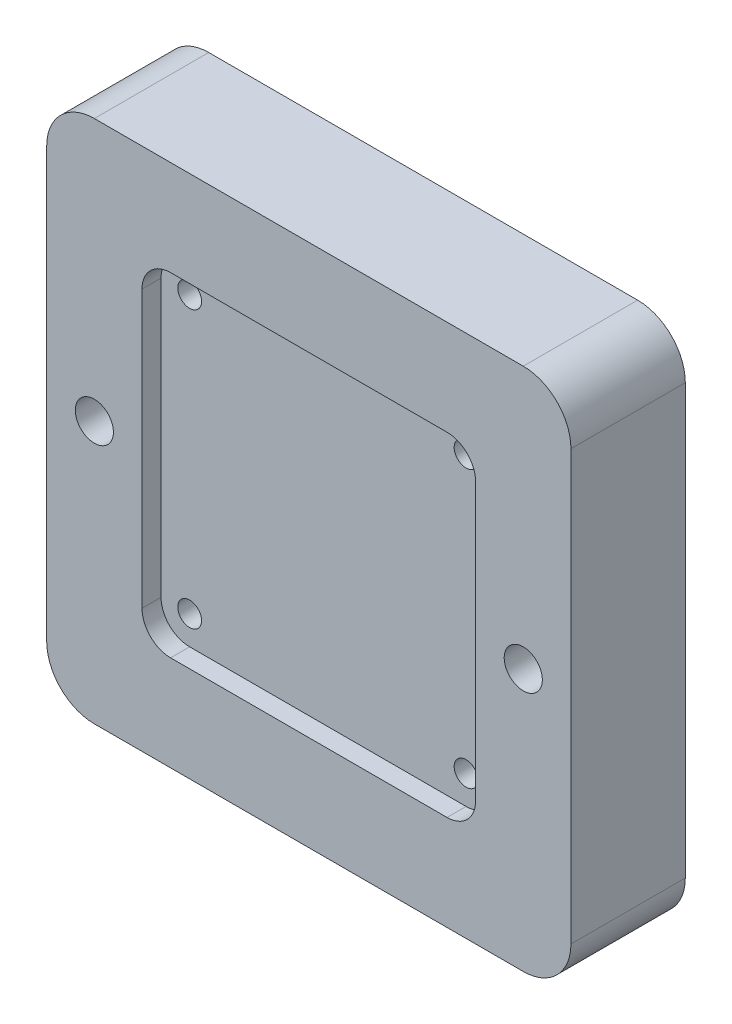
ISO-10303-21;
HEADER;
FILE_DESCRIPTION(('STEP AP214'),'2;1');
FILE_NAME('part.step','',(''),(''),'','','');
FILE_SCHEMA(('AUTOMOTIVE_DESIGN { 1 0 10303 214 1 1 1 1 }'));
ENDSEC;
DATA;
#1=APPLICATION_CONTEXT('core data for automotive mechanical design processes');
#2=APPLICATION_PROTOCOL_DEFINITION('international standard','automotive_design',2000,#1);
#3=PRODUCT_CONTEXT('',#1,'mechanical');
#4=PRODUCT('Part','Part','',(#3));
#5=PRODUCT_RELATED_PRODUCT_CATEGORY('part','',(#4));
#6=PRODUCT_DEFINITION_FORMATION('','',#4);
#7=PRODUCT_DEFINITION_CONTEXT('part definition',#1,'design');
#8=PRODUCT_DEFINITION('design','',#6,#7);
#9=PRODUCT_DEFINITION_SHAPE('','',#8);
#10=(LENGTH_UNIT() NAMED_UNIT(*) SI_UNIT(.MILLI.,.METRE.));
#11=(NAMED_UNIT(*) PLANE_ANGLE_UNIT() SI_UNIT($,.RADIAN.));
#12=(NAMED_UNIT(*) SI_UNIT($,.STERADIAN.) SOLID_ANGLE_UNIT());
#13=UNCERTAINTY_MEASURE_WITH_UNIT(LENGTH_MEASURE(1.E-05),#10,'distance_accuracy_value','');
#14=(GEOMETRIC_REPRESENTATION_CONTEXT(3) GLOBAL_UNCERTAINTY_ASSIGNED_CONTEXT((#13)) GLOBAL_UNIT_ASSIGNED_CONTEXT((#10,
#11,#12)) REPRESENTATION_CONTEXT('',''));
#15=CARTESIAN_POINT('',(0.,0.,0.));
#16=DIRECTION('',(0.,0.,1.));
#17=DIRECTION('',(1.,0.,0.));
#18=AXIS2_PLACEMENT_3D('',#15,#16,#17);
#19=CARTESIAN_POINT('',(45.,45.,-4.));
#20=DIRECTION('',(0.,0.,1.));
#21=DIRECTION('',(1.,0.,0.));
#22=AXIS2_PLACEMENT_3D('',#19,#20,#21);
#23=CYLINDRICAL_SURFACE('',#22,9.99999999999999);
#24=CARTESIAN_POINT('',(45.,45.,0.));
#25=DIRECTION('',(0.,0.,1.));
#26=DIRECTION('',(-1.,0.,0.));
#27=AXIS2_PLACEMENT_3D('',#24,#25,#26);
#28=CIRCLE('',#27,9.99999999999999);
#29=CARTESIAN_POINT('',(55.,45.,0.));
#30=VERTEX_POINT('',#29);
#31=CARTESIAN_POINT('',(45.,55.,0.));
#32=VERTEX_POINT('',#31);
#33=EDGE_CURVE('E284',#30,#32,#28,.T.);
#34=ORIENTED_EDGE('',*,*,#33,.F.);
#35=DIRECTION('',(0.,0.,1.));
#36=VECTOR('',#35,1.);
#37=CARTESIAN_POINT('',(55.,45.,-4.));
#38=LINE('',#37,#36);
#39=CARTESIAN_POINT('',(55.,45.,-24.));
#40=VERTEX_POINT('',#39);
#41=EDGE_CURVE('E11',#40,#30,#38,.T.);
#42=ORIENTED_EDGE('',*,*,#41,.F.);
#43=CARTESIAN_POINT('',(45.,45.,-24.));
#44=DIRECTION('',(0.,0.,1.));
#45=DIRECTION('',(1.,0.,0.));
#46=AXIS2_PLACEMENT_3D('',#43,#44,#45);
#47=CIRCLE('',#46,9.99999999999999);
#48=CARTESIAN_POINT('',(45.,55.,-24.));
#49=VERTEX_POINT('',#48);
#50=EDGE_CURVE('E225',#40,#49,#47,.T.);
#51=ORIENTED_EDGE('',*,*,#50,.T.);
#52=DIRECTION('',(0.,0.,1.));
#53=VECTOR('',#52,1.);
#54=CARTESIAN_POINT('',(45.,55.,-4.));
#55=LINE('',#54,#53);
#56=EDGE_CURVE('E42',#49,#32,#55,.T.);
#57=ORIENTED_EDGE('',*,*,#56,.T.);
#58=EDGE_LOOP('',(#34,#42,#51,#57));
#59=FACE_BOUND('',#58,.T.);
#60=ADVANCED_FACE('F39',(#59),#23,.T.);
#61=CARTESIAN_POINT('',(55.,45.,-4.));
#62=DIRECTION('',(1.,0.,0.));
#63=DIRECTION('',(0.,1.,0.));
#64=AXIS2_PLACEMENT_3D('',#61,#62,#63);
#65=PLANE('',#64);
#66=DIRECTION('',(0.,1.,0.));
#67=VECTOR('',#66,1.);
#68=CARTESIAN_POINT('',(55.,45.,0.));
#69=LINE('',#68,#67);
#70=CARTESIAN_POINT('',(55.,-45.,0.));
#71=VERTEX_POINT('',#70);
#72=EDGE_CURVE('E318',#71,#30,#69,.T.);
#73=ORIENTED_EDGE('',*,*,#72,.F.);
#74=DIRECTION('',(0.,0.,1.));
#75=VECTOR('',#74,1.);
#76=CARTESIAN_POINT('',(55.,-45.,-4.));
#77=LINE('',#76,#75);
#78=CARTESIAN_POINT('',(55.,-45.,-24.));
#79=VERTEX_POINT('',#78);
#80=EDGE_CURVE('E47',#79,#71,#77,.T.);
#81=ORIENTED_EDGE('',*,*,#80,.F.);
#82=DIRECTION('',(0.,1.,0.));
#83=VECTOR('',#82,1.);
#84=CARTESIAN_POINT('',(55.,45.,-24.));
#85=LINE('',#84,#83);
#86=EDGE_CURVE('E222',#79,#40,#85,.T.);
#87=ORIENTED_EDGE('',*,*,#86,.T.);
#88=ORIENTED_EDGE('',*,*,#41,.T.);
#89=EDGE_LOOP('',(#73,#81,#87,#88));
#90=FACE_BOUND('',#89,.T.);
#91=ADVANCED_FACE('F343',(#90),#65,.T.);
#92=CARTESIAN_POINT('',(45.,-45.,-4.));
#93=DIRECTION('',(0.,0.,1.));
#94=DIRECTION('',(1.,0.,0.));
#95=AXIS2_PLACEMENT_3D('',#92,#93,#94);
#96=CYLINDRICAL_SURFACE('',#95,10.);
#97=CARTESIAN_POINT('',(45.,-45.,0.));
#98=DIRECTION('',(0.,0.,1.));
#99=DIRECTION('',(-1.,0.,0.));
#100=AXIS2_PLACEMENT_3D('',#97,#98,#99);
#101=CIRCLE('',#100,10.);
#102=CARTESIAN_POINT('',(45.,-55.,0.));
#103=VERTEX_POINT('',#102);
#104=EDGE_CURVE('E315',#103,#71,#101,.T.);
#105=ORIENTED_EDGE('',*,*,#104,.F.);
#106=DIRECTION('',(0.,0.,1.));
#107=VECTOR('',#106,1.);
#108=CARTESIAN_POINT('',(45.,-55.,-4.));
#109=LINE('',#108,#107);
#110=CARTESIAN_POINT('',(45.,-55.,-24.));
#111=VERTEX_POINT('',#110);
#112=EDGE_CURVE('E322',#111,#103,#109,.T.);
#113=ORIENTED_EDGE('',*,*,#112,.F.);
#114=CARTESIAN_POINT('',(45.,-45.,-24.));
#115=DIRECTION('',(0.,0.,1.));
#116=DIRECTION('',(1.,0.,0.));
#117=AXIS2_PLACEMENT_3D('',#114,#115,#116);
#118=CIRCLE('',#117,10.);
#119=EDGE_CURVE('E219',#111,#79,#118,.T.);
#120=ORIENTED_EDGE('',*,*,#119,.T.);
#121=ORIENTED_EDGE('',*,*,#80,.T.);
#122=EDGE_LOOP('',(#105,#113,#120,#121));
#123=FACE_BOUND('',#122,.T.);
#124=ADVANCED_FACE('F364',(#123),#96,.T.);
#125=CARTESIAN_POINT('',(-45.,-55.,-4.));
#126=DIRECTION('',(0.,-1.,0.));
#127=DIRECTION('',(1.,0.,0.));
#128=AXIS2_PLACEMENT_3D('',#125,#126,#127);
#129=PLANE('',#128);
#130=DIRECTION('',(1.,0.,0.));
#131=VECTOR('',#130,1.);
#132=CARTESIAN_POINT('',(-45.,-55.,0.));
#133=LINE('',#132,#131);
#134=CARTESIAN_POINT('',(-45.,-55.,0.));
#135=VERTEX_POINT('',#134);
#136=EDGE_CURVE('E312',#135,#103,#133,.T.);
#137=ORIENTED_EDGE('',*,*,#136,.F.);
#138=DIRECTION('',(0.,0.,1.));
#139=VECTOR('',#138,1.);
#140=CARTESIAN_POINT('',(-45.,-55.,-4.));
#141=LINE('',#140,#139);
#142=CARTESIAN_POINT('',(-45.,-55.,-24.));
#143=VERTEX_POINT('',#142);
#144=EDGE_CURVE('E324',#143,#135,#141,.T.);
#145=ORIENTED_EDGE('',*,*,#144,.F.);
#146=DIRECTION('',(1.,0.,0.));
#147=VECTOR('',#146,1.);
#148=CARTESIAN_POINT('',(-45.,-55.,-24.));
#149=LINE('',#148,#147);
#150=EDGE_CURVE('E216',#143,#111,#149,.T.);
#151=ORIENTED_EDGE('',*,*,#150,.T.);
#152=ORIENTED_EDGE('',*,*,#112,.T.);
#153=EDGE_LOOP('',(#137,#145,#151,#152));
#154=FACE_BOUND('',#153,.T.);
#155=ADVANCED_FACE('F362',(#154),#129,.T.);
#156=CARTESIAN_POINT('',(-45.,-45.,-4.));
#157=DIRECTION('',(0.,0.,1.));
#158=DIRECTION('',(1.,0.,0.));
#159=AXIS2_PLACEMENT_3D('',#156,#157,#158);
#160=CYLINDRICAL_SURFACE('',#159,10.);
#161=CARTESIAN_POINT('',(-45.,-45.,0.));
#162=DIRECTION('',(0.,0.,1.));
#163=DIRECTION('',(-1.,0.,0.));
#164=AXIS2_PLACEMENT_3D('',#161,#162,#163);
#165=CIRCLE('',#164,10.);
#166=CARTESIAN_POINT('',(-55.,-45.,0.));
#167=VERTEX_POINT('',#166);
#168=EDGE_CURVE('E309',#167,#135,#165,.T.);
#169=ORIENTED_EDGE('',*,*,#168,.F.);
#170=DIRECTION('',(0.,0.,1.));
#171=VECTOR('',#170,1.);
#172=CARTESIAN_POINT('',(-55.,-45.,-4.));
#173=LINE('',#172,#171);
#174=CARTESIAN_POINT('',(-55.,-45.,-24.));
#175=VERTEX_POINT('',#174);
#176=EDGE_CURVE('E326',#175,#167,#173,.T.);
#177=ORIENTED_EDGE('',*,*,#176,.F.);
#178=CARTESIAN_POINT('',(-45.,-45.,-24.));
#179=DIRECTION('',(0.,0.,1.));
#180=DIRECTION('',(1.,0.,0.));
#181=AXIS2_PLACEMENT_3D('',#178,#179,#180);
#182=CIRCLE('',#181,10.);
#183=EDGE_CURVE('E213',#175,#143,#182,.T.);
#184=ORIENTED_EDGE('',*,*,#183,.T.);
#185=ORIENTED_EDGE('',*,*,#144,.T.);
#186=EDGE_LOOP('',(#169,#177,#184,#185));
#187=FACE_BOUND('',#186,.T.);
#188=ADVANCED_FACE('F358',(#187),#160,.T.);
#189=CARTESIAN_POINT('',(-55.,45.,-4.));
#190=DIRECTION('',(-1.,0.,0.));
#191=DIRECTION('',(0.,-1.,0.));
#192=AXIS2_PLACEMENT_3D('',#189,#190,#191);
#193=PLANE('',#192);
#194=DIRECTION('',(0.,-1.,0.));
#195=VECTOR('',#194,1.);
#196=CARTESIAN_POINT('',(-55.,45.,0.));
#197=LINE('',#196,#195);
#198=CARTESIAN_POINT('',(-55.0000000000001,45.,0.));
#199=VERTEX_POINT('',#198);
#200=EDGE_CURVE('E306',#199,#167,#197,.T.);
#201=ORIENTED_EDGE('',*,*,#200,.F.);
#202=DIRECTION('',(0.,0.,1.));
#203=VECTOR('',#202,1.);
#204=CARTESIAN_POINT('',(-55.0000000000001,45.,-4.));
#205=LINE('',#204,#203);
#206=CARTESIAN_POINT('',(-55.0000000000001,45.,-24.));
#207=VERTEX_POINT('',#206);
#208=EDGE_CURVE('E328',#207,#199,#205,.T.);
#209=ORIENTED_EDGE('',*,*,#208,.F.);
#210=DIRECTION('',(0.,-1.,0.));
#211=VECTOR('',#210,1.);
#212=CARTESIAN_POINT('',(-55.0000000000001,45.,-24.));
#213=LINE('',#212,#211);
#214=EDGE_CURVE('E234',#207,#175,#213,.T.);
#215=ORIENTED_EDGE('',*,*,#214,.T.);
#216=ORIENTED_EDGE('',*,*,#176,.T.);
#217=EDGE_LOOP('',(#201,#209,#215,#216));
#218=FACE_BOUND('',#217,.T.);
#219=ADVANCED_FACE('F356',(#218),#193,.T.);
#220=CARTESIAN_POINT('',(-45.,45.,-4.));
#221=DIRECTION('',(0.,0.,1.));
#222=DIRECTION('',(1.,0.,0.));
#223=AXIS2_PLACEMENT_3D('',#220,#221,#222);
#224=CYLINDRICAL_SURFACE('',#223,10.);
#225=CARTESIAN_POINT('',(-45.,45.,0.));
#226=DIRECTION('',(0.,0.,1.));
#227=DIRECTION('',(1.,0.,0.));
#228=AXIS2_PLACEMENT_3D('',#225,#226,#227);
#229=CIRCLE('',#228,10.);
#230=CARTESIAN_POINT('',(-45.,55.,0.));
#231=VERTEX_POINT('',#230);
#232=EDGE_CURVE('E303',#231,#199,#229,.T.);
#233=ORIENTED_EDGE('',*,*,#232,.F.);
#234=DIRECTION('',(0.,0.,1.));
#235=VECTOR('',#234,1.);
#236=CARTESIAN_POINT('',(-45.,55.,-4.));
#237=LINE('',#236,#235);
#238=CARTESIAN_POINT('',(-45.,55.,-24.));
#239=VERTEX_POINT('',#238);
#240=EDGE_CURVE('E329',#239,#231,#237,.T.);
#241=ORIENTED_EDGE('',*,*,#240,.F.);
#242=CARTESIAN_POINT('',(-45.,45.,-24.));
#243=DIRECTION('',(0.,0.,1.));
#244=DIRECTION('',(1.,0.,0.));
#245=AXIS2_PLACEMENT_3D('',#242,#243,#244);
#246=CIRCLE('',#245,10.);
#247=EDGE_CURVE('E231',#239,#207,#246,.T.);
#248=ORIENTED_EDGE('',*,*,#247,.T.);
#249=ORIENTED_EDGE('',*,*,#208,.T.);
#250=EDGE_LOOP('',(#233,#241,#248,#249));
#251=FACE_BOUND('',#250,.T.);
#252=ADVANCED_FACE('F352',(#251),#224,.T.);
#253=CARTESIAN_POINT('',(-45.,55.,-4.));
#254=DIRECTION('',(0.,1.,0.));
#255=DIRECTION('',(-1.,0.,0.));
#256=AXIS2_PLACEMENT_3D('',#253,#254,#255);
#257=PLANE('',#256);
#258=DIRECTION('',(-1.,0.,0.));
#259=VECTOR('',#258,1.);
#260=CARTESIAN_POINT('',(-45.,55.,0.));
#261=LINE('',#260,#259);
#262=EDGE_CURVE('E300',#32,#231,#261,.T.);
#263=ORIENTED_EDGE('',*,*,#262,.F.);
#264=ORIENTED_EDGE('',*,*,#56,.F.);
#265=DIRECTION('',(-1.,0.,0.));
#266=VECTOR('',#265,1.);
#267=CARTESIAN_POINT('',(-45.,55.,-24.));
#268=LINE('',#267,#266);
#269=EDGE_CURVE('E228',#49,#239,#268,.T.);
#270=ORIENTED_EDGE('',*,*,#269,.T.);
#271=ORIENTED_EDGE('',*,*,#240,.T.);
#272=EDGE_LOOP('',(#263,#264,#270,#271));
#273=FACE_BOUND('',#272,.T.);
#274=ADVANCED_FACE('F337',(#273),#257,.T.);
#275=CARTESIAN_POINT('',(45.,45.,0.));
#276=DIRECTION('',(0.,0.,-1.));
#277=DIRECTION('',(-1.,0.,0.));
#278=AXIS2_PLACEMENT_3D('',#275,#276,#277);
#279=PLANE('',#278);
#280=CARTESIAN_POINT('',(-45.,0.,0.));
#281=DIRECTION('',(0.,0.,1.));
#282=DIRECTION('',(1.,0.,0.));
#283=AXIS2_PLACEMENT_3D('',#280,#281,#282);
#284=CIRCLE('',#283,3.99999999999999);
#285=CARTESIAN_POINT('',(-41.,0.,0.));
#286=VERTEX_POINT('',#285);
#287=EDGE_CURVE('E201',#286,#286,#284,.T.);
#288=ORIENTED_EDGE('',*,*,#287,.F.);
#289=EDGE_LOOP('',(#288));
#290=FACE_BOUND('',#289,.T.);
#291=CARTESIAN_POINT('',(45.,0.,0.));
#292=DIRECTION('',(0.,0.,1.));
#293=DIRECTION('',(1.,0.,0.));
#294=AXIS2_PLACEMENT_3D('',#291,#292,#293);
#295=CIRCLE('',#294,3.99999999999999);
#296=CARTESIAN_POINT('',(49.,0.,0.));
#297=VERTEX_POINT('',#296);
#298=EDGE_CURVE('E207',#297,#297,#295,.T.);
#299=ORIENTED_EDGE('',*,*,#298,.F.);
#300=EDGE_LOOP('',(#299));
#301=FACE_BOUND('',#300,.T.);
#302=DIRECTION('',(1.,0.,0.));
#303=VECTOR('',#302,1.);
#304=CARTESIAN_POINT('',(-29.,-35.,0.));
#305=LINE('',#304,#303);
#306=CARTESIAN_POINT('',(-29.,-35.,0.));
#307=VERTEX_POINT('',#306);
#308=CARTESIAN_POINT('',(29.,-35.,0.));
#309=VERTEX_POINT('',#308);
#310=EDGE_CURVE('E262',#307,#309,#305,.T.);
#311=ORIENTED_EDGE('',*,*,#310,.F.);
#312=CARTESIAN_POINT('',(-29.,-29.,0.));
#313=DIRECTION('',(0.,0.,1.));
#314=DIRECTION('',(1.,0.,0.));
#315=AXIS2_PLACEMENT_3D('',#312,#313,#314);
#316=CIRCLE('',#315,6.);
#317=CARTESIAN_POINT('',(-35.,-29.,0.));
#318=VERTEX_POINT('',#317);
#319=EDGE_CURVE('E63',#318,#307,#316,.T.);
#320=ORIENTED_EDGE('',*,*,#319,.F.);
#321=DIRECTION('',(0.,-1.,0.));
#322=VECTOR('',#321,1.);
#323=CARTESIAN_POINT('',(-35.,29.,0.));
#324=LINE('',#323,#322);
#325=CARTESIAN_POINT('',(-35.,29.,0.));
#326=VERTEX_POINT('',#325);
#327=EDGE_CURVE('E241',#326,#318,#324,.T.);
#328=ORIENTED_EDGE('',*,*,#327,.F.);
#329=CARTESIAN_POINT('',(-29.,29.,0.));
#330=DIRECTION('',(0.,0.,1.));
#331=DIRECTION('',(1.,0.,0.));
#332=AXIS2_PLACEMENT_3D('',#329,#330,#331);
#333=CIRCLE('',#332,6.);
#334=CARTESIAN_POINT('',(-29.,35.,0.));
#335=VERTEX_POINT('',#334);
#336=EDGE_CURVE('E277',#335,#326,#333,.T.);
#337=ORIENTED_EDGE('',*,*,#336,.F.);
#338=DIRECTION('',(-1.,0.,0.));
#339=VECTOR('',#338,1.);
#340=CARTESIAN_POINT('',(-29.,35.,0.));
#341=LINE('',#340,#339);
#342=CARTESIAN_POINT('',(29.,35.,0.));
#343=VERTEX_POINT('',#342);
#344=EDGE_CURVE('E274',#343,#335,#341,.T.);
#345=ORIENTED_EDGE('',*,*,#344,.F.);
#346=CARTESIAN_POINT('',(29.,29.,0.));
#347=DIRECTION('',(0.,0.,1.));
#348=DIRECTION('',(1.,0.,0.));
#349=AXIS2_PLACEMENT_3D('',#346,#347,#348);
#350=CIRCLE('',#349,5.99999999999998);
#351=CARTESIAN_POINT('',(35.,29.,0.));
#352=VERTEX_POINT('',#351);
#353=EDGE_CURVE('E271',#352,#343,#350,.T.);
#354=ORIENTED_EDGE('',*,*,#353,.F.);
#355=DIRECTION('',(0.,1.,0.));
#356=VECTOR('',#355,1.);
#357=CARTESIAN_POINT('',(35.,29.,0.));
#358=LINE('',#357,#356);
#359=CARTESIAN_POINT('',(35.,-29.,0.));
#360=VERTEX_POINT('',#359);
#361=EDGE_CURVE('E268',#360,#352,#358,.T.);
#362=ORIENTED_EDGE('',*,*,#361,.F.);
#363=CARTESIAN_POINT('',(29.,-29.,0.));
#364=DIRECTION('',(0.,0.,1.));
#365=DIRECTION('',(1.,0.,0.));
#366=AXIS2_PLACEMENT_3D('',#363,#364,#365);
#367=CIRCLE('',#366,6.);
#368=EDGE_CURVE('E265',#309,#360,#367,.T.);
#369=ORIENTED_EDGE('',*,*,#368,.F.);
#370=EDGE_LOOP('',(#311,#320,#328,#337,#345,#354,#362,#369));
#371=FACE_BOUND('',#370,.T.);
#372=ORIENTED_EDGE('',*,*,#33,.T.);
#373=ORIENTED_EDGE('',*,*,#262,.T.);
#374=ORIENTED_EDGE('',*,*,#232,.T.);
#375=ORIENTED_EDGE('',*,*,#200,.T.);
#376=ORIENTED_EDGE('',*,*,#168,.T.);
#377=ORIENTED_EDGE('',*,*,#136,.T.);
#378=ORIENTED_EDGE('',*,*,#104,.T.);
#379=ORIENTED_EDGE('',*,*,#72,.T.);
#380=EDGE_LOOP('',(#372,#373,#374,#375,#376,#377,#378,#379));
#381=FACE_BOUND('',#380,.T.);
#382=ADVANCED_FACE('F339',(#290,#301,#371,#381),#279,.F.);
#383=CARTESIAN_POINT('',(-29.,-29.,-4.));
#384=DIRECTION('',(0.,0.,1.));
#385=DIRECTION('',(1.,0.,0.));
#386=AXIS2_PLACEMENT_3D('',#383,#384,#385);
#387=CYLINDRICAL_SURFACE('',#386,6.);
#388=ORIENTED_EDGE('',*,*,#319,.T.);
#389=DIRECTION('',(0.,0.,1.));
#390=VECTOR('',#389,1.);
#391=CARTESIAN_POINT('',(-29.,-35.,-4.));
#392=LINE('',#391,#390);
#393=CARTESIAN_POINT('',(-29.,-35.,-4.));
#394=VERTEX_POINT('',#393);
#395=EDGE_CURVE('E260',#394,#307,#392,.T.);
#396=ORIENTED_EDGE('',*,*,#395,.F.);
#397=CARTESIAN_POINT('',(-29.,-29.,-4.));
#398=DIRECTION('',(0.,0.,1.));
#399=DIRECTION('',(1.,0.,0.));
#400=AXIS2_PLACEMENT_3D('',#397,#398,#399);
#401=CIRCLE('',#400,6.);
#402=CARTESIAN_POINT('',(-35.,-29.,-4.));
#403=VERTEX_POINT('',#402);
#404=EDGE_CURVE('E237',#403,#394,#401,.T.);
#405=ORIENTED_EDGE('',*,*,#404,.F.);
#406=DIRECTION('',(0.,0.,1.));
#407=VECTOR('',#406,1.);
#408=CARTESIAN_POINT('',(-35.,-29.,-4.));
#409=LINE('',#408,#407);
#410=EDGE_CURVE('E282',#403,#318,#409,.T.);
#411=ORIENTED_EDGE('',*,*,#410,.T.);
#412=EDGE_LOOP('',(#388,#396,#405,#411));
#413=FACE_BOUND('',#412,.T.);
#414=ADVANCED_FACE('F584',(#413),#387,.F.);
#415=CARTESIAN_POINT('',(-35.,29.,-4.));
#416=DIRECTION('',(-1.,0.,0.));
#417=DIRECTION('',(0.,0.,1.));
#418=AXIS2_PLACEMENT_3D('',#415,#416,#417);
#419=PLANE('',#418);
#420=ORIENTED_EDGE('',*,*,#327,.T.);
#421=ORIENTED_EDGE('',*,*,#410,.F.);
#422=DIRECTION('',(0.,-1.,0.));
#423=VECTOR('',#422,1.);
#424=CARTESIAN_POINT('',(-35.,29.,-4.));
#425=LINE('',#424,#423);
#426=CARTESIAN_POINT('',(-35.,29.,-4.));
#427=VERTEX_POINT('',#426);
#428=EDGE_CURVE('E257',#427,#403,#425,.T.);
#429=ORIENTED_EDGE('',*,*,#428,.F.);
#430=DIRECTION('',(0.,0.,1.));
#431=VECTOR('',#430,1.);
#432=CARTESIAN_POINT('',(-35.,29.,-4.));
#433=LINE('',#432,#431);
#434=EDGE_CURVE('E285',#427,#326,#433,.T.);
#435=ORIENTED_EDGE('',*,*,#434,.T.);
#436=EDGE_LOOP('',(#420,#421,#429,#435));
#437=FACE_BOUND('',#436,.T.);
#438=ADVANCED_FACE('F580',(#437),#419,.F.);
#439=CARTESIAN_POINT('',(-29.,29.,-4.));
#440=DIRECTION('',(0.,0.,1.));
#441=DIRECTION('',(1.,0.,0.));
#442=AXIS2_PLACEMENT_3D('',#439,#440,#441);
#443=CYLINDRICAL_SURFACE('',#442,6.);
#444=ORIENTED_EDGE('',*,*,#336,.T.);
#445=ORIENTED_EDGE('',*,*,#434,.F.);
#446=CARTESIAN_POINT('',(-29.,29.,-4.));
#447=DIRECTION('',(0.,0.,1.));
#448=DIRECTION('',(1.,0.,0.));
#449=AXIS2_PLACEMENT_3D('',#446,#447,#448);
#450=CIRCLE('',#449,6.);
#451=CARTESIAN_POINT('',(-29.,35.,-4.));
#452=VERTEX_POINT('',#451);
#453=EDGE_CURVE('E254',#452,#427,#450,.T.);
#454=ORIENTED_EDGE('',*,*,#453,.F.);
#455=DIRECTION('',(0.,0.,1.));
#456=VECTOR('',#455,1.);
#457=CARTESIAN_POINT('',(-29.,35.,-4.));
#458=LINE('',#457,#456);
#459=EDGE_CURVE('E287',#452,#335,#458,.T.);
#460=ORIENTED_EDGE('',*,*,#459,.T.);
#461=EDGE_LOOP('',(#444,#445,#454,#460));
#462=FACE_BOUND('',#461,.T.);
#463=ADVANCED_FACE('F583',(#462),#443,.F.);
#464=CARTESIAN_POINT('',(-29.,35.,-4.));
#465=DIRECTION('',(0.,1.,0.));
#466=DIRECTION('',(-1.,0.,0.));
#467=AXIS2_PLACEMENT_3D('',#464,#465,#466);
#468=PLANE('',#467);
#469=ORIENTED_EDGE('',*,*,#344,.T.);
#470=ORIENTED_EDGE('',*,*,#459,.F.);
#471=DIRECTION('',(-1.,0.,0.));
#472=VECTOR('',#471,1.);
#473=CARTESIAN_POINT('',(-29.,35.,-4.));
#474=LINE('',#473,#472);
#475=CARTESIAN_POINT('',(29.,35.,-4.));
#476=VERTEX_POINT('',#475);
#477=EDGE_CURVE('E251',#476,#452,#474,.T.);
#478=ORIENTED_EDGE('',*,*,#477,.F.);
#479=DIRECTION('',(0.,0.,1.));
#480=VECTOR('',#479,1.);
#481=CARTESIAN_POINT('',(29.,35.,-4.));
#482=LINE('',#481,#480);
#483=EDGE_CURVE('E289',#476,#343,#482,.T.);
#484=ORIENTED_EDGE('',*,*,#483,.T.);
#485=EDGE_LOOP('',(#469,#470,#478,#484));
#486=FACE_BOUND('',#485,.T.);
#487=ADVANCED_FACE('F588',(#486),#468,.F.);
#488=CARTESIAN_POINT('',(29.,29.,-4.));
#489=DIRECTION('',(0.,0.,1.));
#490=DIRECTION('',(1.,0.,0.));
#491=AXIS2_PLACEMENT_3D('',#488,#489,#490);
#492=CYLINDRICAL_SURFACE('',#491,5.99999999999998);
#493=ORIENTED_EDGE('',*,*,#353,.T.);
#494=ORIENTED_EDGE('',*,*,#483,.F.);
#495=CARTESIAN_POINT('',(29.,29.,-4.));
#496=DIRECTION('',(0.,0.,1.));
#497=DIRECTION('',(1.,0.,0.));
#498=AXIS2_PLACEMENT_3D('',#495,#496,#497);
#499=CIRCLE('',#498,5.99999999999998);
#500=CARTESIAN_POINT('',(35.,29.,-4.));
#501=VERTEX_POINT('',#500);
#502=EDGE_CURVE('E248',#501,#476,#499,.T.);
#503=ORIENTED_EDGE('',*,*,#502,.F.);
#504=DIRECTION('',(0.,0.,1.));
#505=VECTOR('',#504,1.);
#506=CARTESIAN_POINT('',(35.,29.,-4.));
#507=LINE('',#506,#505);
#508=EDGE_CURVE('E291',#501,#352,#507,.T.);
#509=ORIENTED_EDGE('',*,*,#508,.T.);
#510=EDGE_LOOP('',(#493,#494,#503,#509));
#511=FACE_BOUND('',#510,.T.);
#512=ADVANCED_FACE('F592',(#511),#492,.F.);
#513=CARTESIAN_POINT('',(35.,29.,-4.));
#514=DIRECTION('',(1.,0.,0.));
#515=DIRECTION('',(0.,1.,0.));
#516=AXIS2_PLACEMENT_3D('',#513,#514,#515);
#517=PLANE('',#516);
#518=ORIENTED_EDGE('',*,*,#361,.T.);
#519=ORIENTED_EDGE('',*,*,#508,.F.);
#520=DIRECTION('',(0.,1.,0.));
#521=VECTOR('',#520,1.);
#522=CARTESIAN_POINT('',(35.,29.,-4.));
#523=LINE('',#522,#521);
#524=CARTESIAN_POINT('',(35.,-29.,-4.));
#525=VERTEX_POINT('',#524);
#526=EDGE_CURVE('E245',#525,#501,#523,.T.);
#527=ORIENTED_EDGE('',*,*,#526,.F.);
#528=DIRECTION('',(0.,0.,1.));
#529=VECTOR('',#528,1.);
#530=CARTESIAN_POINT('',(35.,-29.,-4.));
#531=LINE('',#530,#529);
#532=EDGE_CURVE('E293',#525,#360,#531,.T.);
#533=ORIENTED_EDGE('',*,*,#532,.T.);
#534=EDGE_LOOP('',(#518,#519,#527,#533));
#535=FACE_BOUND('',#534,.T.);
#536=ADVANCED_FACE('F596',(#535),#517,.F.);
#537=CARTESIAN_POINT('',(29.,-29.,-4.));
#538=DIRECTION('',(0.,0.,1.));
#539=DIRECTION('',(1.,0.,0.));
#540=AXIS2_PLACEMENT_3D('',#537,#538,#539);
#541=CYLINDRICAL_SURFACE('',#540,6.);
#542=ORIENTED_EDGE('',*,*,#368,.T.);
#543=ORIENTED_EDGE('',*,*,#532,.F.);
#544=CARTESIAN_POINT('',(29.,-29.,-4.));
#545=DIRECTION('',(0.,0.,1.));
#546=DIRECTION('',(1.,0.,0.));
#547=AXIS2_PLACEMENT_3D('',#544,#545,#546);
#548=CIRCLE('',#547,6.);
#549=CARTESIAN_POINT('',(29.,-35.,-4.));
#550=VERTEX_POINT('',#549);
#551=EDGE_CURVE('E55',#550,#525,#548,.T.);
#552=ORIENTED_EDGE('',*,*,#551,.F.);
#553=DIRECTION('',(0.,0.,1.));
#554=VECTOR('',#553,1.);
#555=CARTESIAN_POINT('',(29.,-35.,-4.));
#556=LINE('',#555,#554);
#557=EDGE_CURVE('E295',#550,#309,#556,.T.);
#558=ORIENTED_EDGE('',*,*,#557,.T.);
#559=EDGE_LOOP('',(#542,#543,#552,#558));
#560=FACE_BOUND('',#559,.T.);
#561=ADVANCED_FACE('F600',(#560),#541,.F.);
#562=CARTESIAN_POINT('',(-29.,-35.,-4.));
#563=DIRECTION('',(0.,-1.,0.));
#564=DIRECTION('',(1.,0.,0.));
#565=AXIS2_PLACEMENT_3D('',#562,#563,#564);
#566=PLANE('',#565);
#567=ORIENTED_EDGE('',*,*,#310,.T.);
#568=ORIENTED_EDGE('',*,*,#557,.F.);
#569=DIRECTION('',(1.,0.,0.));
#570=VECTOR('',#569,1.);
#571=CARTESIAN_POINT('',(-29.,-35.,-4.));
#572=LINE('',#571,#570);
#573=EDGE_CURVE('E240',#394,#550,#572,.T.);
#574=ORIENTED_EDGE('',*,*,#573,.F.);
#575=ORIENTED_EDGE('',*,*,#395,.T.);
#576=EDGE_LOOP('',(#567,#568,#574,#575));
#577=FACE_BOUND('',#576,.T.);
#578=ADVANCED_FACE('F450',(#577),#566,.F.);
#579=CARTESIAN_POINT('',(-45.,-45.,-4.));
#580=DIRECTION('',(0.,0.,1.));
#581=DIRECTION('',(1.,0.,0.));
#582=AXIS2_PLACEMENT_3D('',#579,#580,#581);
#583=PLANE('',#582);
#584=CARTESIAN_POINT('',(-29.,29.,-4.));
#585=DIRECTION('',(0.,0.,1.));
#586=DIRECTION('',(1.,0.,0.));
#587=AXIS2_PLACEMENT_3D('',#584,#585,#586);
#588=CIRCLE('',#587,2.5);
#589=CARTESIAN_POINT('',(-26.5,29.,-4.));
#590=VERTEX_POINT('',#589);
#591=EDGE_CURVE('E179',#590,#590,#588,.T.);
#592=ORIENTED_EDGE('',*,*,#591,.F.);
#593=EDGE_LOOP('',(#592));
#594=FACE_BOUND('',#593,.T.);
#595=CARTESIAN_POINT('',(29.,29.,-4.));
#596=DIRECTION('',(0.,0.,1.));
#597=DIRECTION('',(1.,0.,0.));
#598=AXIS2_PLACEMENT_3D('',#595,#596,#597);
#599=CIRCLE('',#598,2.5);
#600=CARTESIAN_POINT('',(31.5,29.,-4.));
#601=VERTEX_POINT('',#600);
#602=EDGE_CURVE('E178',#601,#601,#599,.T.);
#603=ORIENTED_EDGE('',*,*,#602,.F.);
#604=EDGE_LOOP('',(#603));
#605=FACE_BOUND('',#604,.T.);
#606=CARTESIAN_POINT('',(29.,-29.,-4.));
#607=DIRECTION('',(0.,0.,1.));
#608=DIRECTION('',(1.,0.,0.));
#609=AXIS2_PLACEMENT_3D('',#606,#607,#608);
#610=CIRCLE('',#609,2.5);
#611=CARTESIAN_POINT('',(31.5,-29.,-4.));
#612=VERTEX_POINT('',#611);
#613=EDGE_CURVE('E189',#612,#612,#610,.T.);
#614=ORIENTED_EDGE('',*,*,#613,.F.);
#615=EDGE_LOOP('',(#614));
#616=FACE_BOUND('',#615,.T.);
#617=CARTESIAN_POINT('',(-29.,-29.,-4.));
#618=DIRECTION('',(0.,0.,1.));
#619=DIRECTION('',(1.,0.,0.));
#620=AXIS2_PLACEMENT_3D('',#617,#618,#619);
#621=CIRCLE('',#620,2.5);
#622=CARTESIAN_POINT('',(-26.5,-29.,-4.));
#623=VERTEX_POINT('',#622);
#624=EDGE_CURVE('E195',#623,#623,#621,.T.);
#625=ORIENTED_EDGE('',*,*,#624,.F.);
#626=EDGE_LOOP('',(#625));
#627=FACE_BOUND('',#626,.T.);
#628=ORIENTED_EDGE('',*,*,#428,.T.);
#629=ORIENTED_EDGE('',*,*,#404,.T.);
#630=ORIENTED_EDGE('',*,*,#573,.T.);
#631=ORIENTED_EDGE('',*,*,#551,.T.);
#632=ORIENTED_EDGE('',*,*,#526,.T.);
#633=ORIENTED_EDGE('',*,*,#502,.T.);
#634=ORIENTED_EDGE('',*,*,#477,.T.);
#635=ORIENTED_EDGE('',*,*,#453,.T.);
#636=EDGE_LOOP('',(#628,#629,#630,#631,#632,#633,#634,#635));
#637=FACE_BOUND('',#636,.T.);
#638=ADVANCED_FACE('F444',(#594,#605,#616,#627,#637),#583,.T.);
#639=CARTESIAN_POINT('',(-45.,-45.,-24.));
#640=DIRECTION('',(0.,0.,1.));
#641=DIRECTION('',(1.,0.,0.));
#642=AXIS2_PLACEMENT_3D('',#639,#640,#641);
#643=PLANE('',#642);
#644=ORIENTED_EDGE('',*,*,#183,.F.);
#645=ORIENTED_EDGE('',*,*,#214,.F.);
#646=ORIENTED_EDGE('',*,*,#247,.F.);
#647=ORIENTED_EDGE('',*,*,#269,.F.);
#648=ORIENTED_EDGE('',*,*,#50,.F.);
#649=ORIENTED_EDGE('',*,*,#86,.F.);
#650=ORIENTED_EDGE('',*,*,#119,.F.);
#651=ORIENTED_EDGE('',*,*,#150,.F.);
#652=EDGE_LOOP('',(#644,#645,#646,#647,#648,#649,#650,#651));
#653=FACE_BOUND('',#652,.T.);
#654=ADVANCED_FACE('F347',(#653),#643,.F.);
#655=CARTESIAN_POINT('',(45.,0.,-18.));
#656=DIRECTION('',(0.,0.,1.));
#657=DIRECTION('',(1.,0.,0.));
#658=AXIS2_PLACEMENT_3D('',#655,#656,#657);
#659=CONICAL_SURFACE('',#658,4.,1.02974425867665);
#660=CARTESIAN_POINT('',(45.,0.,-20.4034424761102));
#661=VERTEX_POINT('',#660);
#662=VERTEX_LOOP('',#661);
#663=FACE_BOUND('',#662,.T.);
#664=CARTESIAN_POINT('',(45.,0.,-18.));
#665=DIRECTION('',(0.,0.,1.));
#666=DIRECTION('',(1.,0.,0.));
#667=AXIS2_PLACEMENT_3D('',#664,#665,#666);
#668=CIRCLE('',#667,4.);
#669=CARTESIAN_POINT('',(49.,0.,-18.));
#670=VERTEX_POINT('',#669);
#671=EDGE_CURVE('E210',#670,#670,#668,.T.);
#672=ORIENTED_EDGE('',*,*,#671,.T.);
#673=EDGE_LOOP('',(#672));
#674=FACE_BOUND('',#673,.T.);
#675=ADVANCED_FACE('F463',(#663,#674),#659,.F.);
#676=CARTESIAN_POINT('',(45.,0.,0.));
#677=DIRECTION('',(0.,0.,1.));
#678=DIRECTION('',(1.,0.,0.));
#679=AXIS2_PLACEMENT_3D('',#676,#677,#678);
#680=CYLINDRICAL_SURFACE('',#679,3.99999999999999);
#681=ORIENTED_EDGE('',*,*,#671,.F.);
#682=EDGE_LOOP('',(#681));
#683=FACE_BOUND('',#682,.T.);
#684=ORIENTED_EDGE('',*,*,#298,.T.);
#685=EDGE_LOOP('',(#684));
#686=FACE_BOUND('',#685,.T.);
#687=ADVANCED_FACE('F474',(#683,#686),#680,.F.);
#688=CARTESIAN_POINT('',(-45.,0.,-18.));
#689=DIRECTION('',(0.,0.,1.));
#690=DIRECTION('',(1.,0.,0.));
#691=AXIS2_PLACEMENT_3D('',#688,#689,#690);
#692=CONICAL_SURFACE('',#691,4.,1.02974425867665);
#693=CARTESIAN_POINT('',(-45.,0.,-20.4034424761102));
#694=VERTEX_POINT('',#693);
#695=VERTEX_LOOP('',#694);
#696=FACE_BOUND('',#695,.T.);
#697=CARTESIAN_POINT('',(-45.,0.,-18.));
#698=DIRECTION('',(0.,0.,1.));
#699=DIRECTION('',(1.,0.,0.));
#700=AXIS2_PLACEMENT_3D('',#697,#698,#699);
#701=CIRCLE('',#700,4.);
#702=CARTESIAN_POINT('',(-41.,0.,-18.));
#703=VERTEX_POINT('',#702);
#704=EDGE_CURVE('E204',#703,#703,#701,.T.);
#705=ORIENTED_EDGE('',*,*,#704,.T.);
#706=EDGE_LOOP('',(#705));
#707=FACE_BOUND('',#706,.T.);
#708=ADVANCED_FACE('F484',(#696,#707),#692,.F.);
#709=CARTESIAN_POINT('',(-45.,0.,0.));
#710=DIRECTION('',(0.,0.,1.));
#711=DIRECTION('',(1.,0.,0.));
#712=AXIS2_PLACEMENT_3D('',#709,#710,#711);
#713=CYLINDRICAL_SURFACE('',#712,3.99999999999999);
#714=ORIENTED_EDGE('',*,*,#704,.F.);
#715=EDGE_LOOP('',(#714));
#716=FACE_BOUND('',#715,.T.);
#717=ORIENTED_EDGE('',*,*,#287,.T.);
#718=EDGE_LOOP('',(#717));
#719=FACE_BOUND('',#718,.T.);
#720=ADVANCED_FACE('F494',(#716,#719),#713,.F.);
#721=CARTESIAN_POINT('',(-29.,-29.,-14.));
#722=DIRECTION('',(0.,0.,1.));
#723=DIRECTION('',(1.,0.,0.));
#724=AXIS2_PLACEMENT_3D('',#721,#722,#723);
#725=CONICAL_SURFACE('',#724,2.5,1.02974425867665);
#726=CARTESIAN_POINT('',(-29.,-29.,-15.5021515475689));
#727=VERTEX_POINT('',#726);
#728=VERTEX_LOOP('',#727);
#729=FACE_BOUND('',#728,.T.);
#730=CARTESIAN_POINT('',(-29.,-29.,-14.));
#731=DIRECTION('',(0.,0.,1.));
#732=DIRECTION('',(1.,0.,0.));
#733=AXIS2_PLACEMENT_3D('',#730,#731,#732);
#734=CIRCLE('',#733,2.5);
#735=CARTESIAN_POINT('',(-26.5,-29.,-14.));
#736=VERTEX_POINT('',#735);
#737=EDGE_CURVE('E198',#736,#736,#734,.T.);
#738=ORIENTED_EDGE('',*,*,#737,.T.);
#739=EDGE_LOOP('',(#738));
#740=FACE_BOUND('',#739,.T.);
#741=ADVANCED_FACE('F503',(#729,#740),#725,.F.);
#742=CARTESIAN_POINT('',(-29.,-29.,-4.));
#743=DIRECTION('',(0.,0.,1.));
#744=DIRECTION('',(1.,0.,0.));
#745=AXIS2_PLACEMENT_3D('',#742,#743,#744);
#746=CYLINDRICAL_SURFACE('',#745,2.5);
#747=ORIENTED_EDGE('',*,*,#737,.F.);
#748=EDGE_LOOP('',(#747));
#749=FACE_BOUND('',#748,.T.);
#750=ORIENTED_EDGE('',*,*,#624,.T.);
#751=EDGE_LOOP('',(#750));
#752=FACE_BOUND('',#751,.T.);
#753=ADVANCED_FACE('F512',(#749,#752),#746,.F.);
#754=CARTESIAN_POINT('',(29.,-29.,-14.));
#755=DIRECTION('',(0.,0.,1.));
#756=DIRECTION('',(1.,0.,0.));
#757=AXIS2_PLACEMENT_3D('',#754,#755,#756);
#758=CONICAL_SURFACE('',#757,2.5,1.02974425867665);
#759=CARTESIAN_POINT('',(29.,-29.,-15.5021515475689));
#760=VERTEX_POINT('',#759);
#761=VERTEX_LOOP('',#760);
#762=FACE_BOUND('',#761,.T.);
#763=CARTESIAN_POINT('',(29.,-29.,-14.));
#764=DIRECTION('',(0.,0.,1.));
#765=DIRECTION('',(1.,0.,0.));
#766=AXIS2_PLACEMENT_3D('',#763,#764,#765);
#767=CIRCLE('',#766,2.5);
#768=CARTESIAN_POINT('',(31.5,-29.,-14.));
#769=VERTEX_POINT('',#768);
#770=EDGE_CURVE('E192',#769,#769,#767,.T.);
#771=ORIENTED_EDGE('',*,*,#770,.T.);
#772=EDGE_LOOP('',(#771));
#773=FACE_BOUND('',#772,.T.);
#774=ADVANCED_FACE('F522',(#762,#773),#758,.F.);
#775=CARTESIAN_POINT('',(29.,-29.,-4.));
#776=DIRECTION('',(0.,0.,1.));
#777=DIRECTION('',(1.,0.,0.));
#778=AXIS2_PLACEMENT_3D('',#775,#776,#777);
#779=CYLINDRICAL_SURFACE('',#778,2.5);
#780=ORIENTED_EDGE('',*,*,#770,.F.);
#781=EDGE_LOOP('',(#780));
#782=FACE_BOUND('',#781,.T.);
#783=ORIENTED_EDGE('',*,*,#613,.T.);
#784=EDGE_LOOP('',(#783));
#785=FACE_BOUND('',#784,.T.);
#786=ADVANCED_FACE('F532',(#782,#785),#779,.F.);
#787=CARTESIAN_POINT('',(29.,29.,-14.));
#788=DIRECTION('',(0.,0.,1.));
#789=DIRECTION('',(1.,0.,0.));
#790=AXIS2_PLACEMENT_3D('',#787,#788,#789);
#791=CONICAL_SURFACE('',#790,2.5,1.02974425867665);
#792=CARTESIAN_POINT('',(29.,29.,-15.5021515475689));
#793=VERTEX_POINT('',#792);
#794=VERTEX_LOOP('',#793);
#795=FACE_BOUND('',#794,.T.);
#796=CARTESIAN_POINT('',(29.,29.,-14.));
#797=DIRECTION('',(0.,0.,1.));
#798=DIRECTION('',(1.,0.,0.));
#799=AXIS2_PLACEMENT_3D('',#796,#797,#798);
#800=CIRCLE('',#799,2.5);
#801=CARTESIAN_POINT('',(31.5,29.,-14.));
#802=VERTEX_POINT('',#801);
#803=EDGE_CURVE('E182',#802,#802,#800,.T.);
#804=ORIENTED_EDGE('',*,*,#803,.T.);
#805=EDGE_LOOP('',(#804));
#806=FACE_BOUND('',#805,.T.);
#807=ADVANCED_FACE('F542',(#795,#806),#791,.F.);
#808=CARTESIAN_POINT('',(29.,29.,-4.));
#809=DIRECTION('',(0.,0.,1.));
#810=DIRECTION('',(1.,0.,0.));
#811=AXIS2_PLACEMENT_3D('',#808,#809,#810);
#812=CYLINDRICAL_SURFACE('',#811,2.5);
#813=ORIENTED_EDGE('',*,*,#803,.F.);
#814=EDGE_LOOP('',(#813));
#815=FACE_BOUND('',#814,.T.);
#816=ORIENTED_EDGE('',*,*,#602,.T.);
#817=EDGE_LOOP('',(#816));
#818=FACE_BOUND('',#817,.T.);
#819=ADVANCED_FACE('F172',(#815,#818),#812,.F.);
#820=CARTESIAN_POINT('',(-29.,29.,-14.));
#821=DIRECTION('',(0.,0.,1.));
#822=DIRECTION('',(1.,0.,0.));
#823=AXIS2_PLACEMENT_3D('',#820,#821,#822);
#824=CONICAL_SURFACE('',#823,2.5,1.02974425867665);
#825=CARTESIAN_POINT('',(-29.,29.,-15.5021515475689));
#826=VERTEX_POINT('',#825);
#827=VERTEX_LOOP('',#826);
#828=FACE_BOUND('',#827,.T.);
#829=CARTESIAN_POINT('',(-29.,29.,-14.));
#830=DIRECTION('',(0.,0.,1.));
#831=DIRECTION('',(1.,0.,0.));
#832=AXIS2_PLACEMENT_3D('',#829,#830,#831);
#833=CIRCLE('',#832,2.5);
#834=CARTESIAN_POINT('',(-26.5,29.,-14.));
#835=VERTEX_POINT('',#834);
#836=EDGE_CURVE('E176',#835,#835,#833,.T.);
#837=ORIENTED_EDGE('',*,*,#836,.T.);
#838=EDGE_LOOP('',(#837));
#839=FACE_BOUND('',#838,.T.);
#840=ADVANCED_FACE('F168',(#828,#839),#824,.F.);
#841=CARTESIAN_POINT('',(-29.,29.,-4.));
#842=DIRECTION('',(0.,0.,1.));
#843=DIRECTION('',(1.,0.,0.));
#844=AXIS2_PLACEMENT_3D('',#841,#842,#843);
#845=CYLINDRICAL_SURFACE('',#844,2.5);
#846=ORIENTED_EDGE('',*,*,#836,.F.);
#847=EDGE_LOOP('',(#846));
#848=FACE_BOUND('',#847,.T.);
#849=ORIENTED_EDGE('',*,*,#591,.T.);
#850=EDGE_LOOP('',(#849));
#851=FACE_BOUND('',#850,.T.);
#852=ADVANCED_FACE('F171',(#848,#851),#845,.F.);
#853=CLOSED_SHELL('',(#60,#91,#124,#155,#188,#219,#252,#274,#382,#414,#438,#463,#487,#512,#536,
#561,#578,#638,#654,#675,#687,#708,#720,#741,#753,#774,#786,#807,#819,#840,#852));
#854=MANIFOLD_SOLID_BREP('B2',#853);
#855=ADVANCED_BREP_SHAPE_REPRESENTATION('',(#18,#854),#14);
#856=SHAPE_DEFINITION_REPRESENTATION(#9,#855);
ENDSEC;
END-ISO-10303-21;
